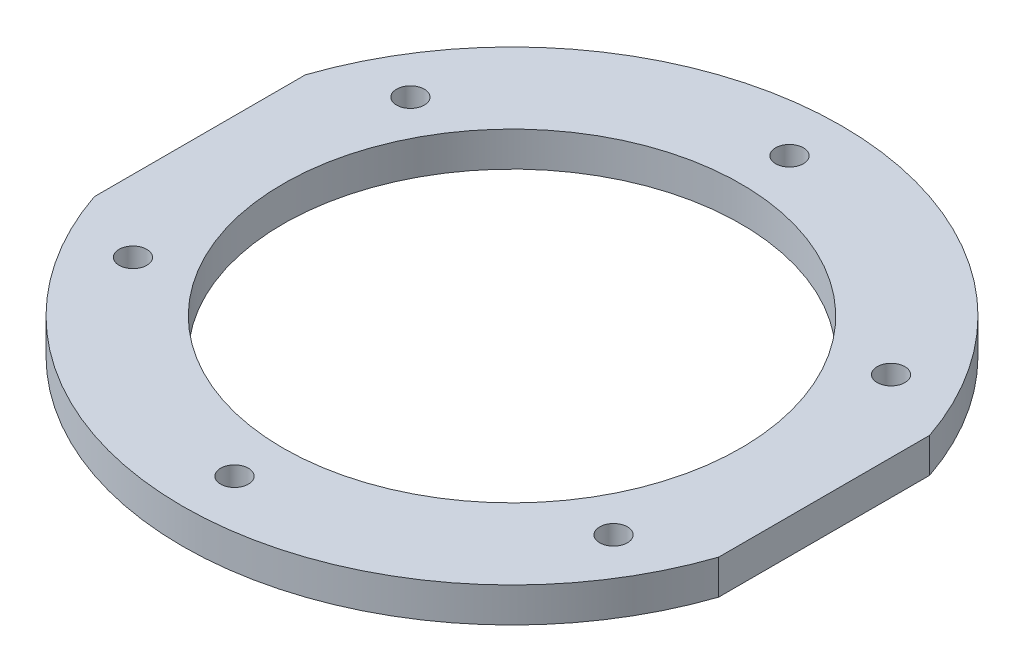
ISO-10303-21;
HEADER;
FILE_DESCRIPTION(('STEP AP214'),'2;1');
FILE_NAME('part.step','',(''),(''),'','','');
FILE_SCHEMA(('AUTOMOTIVE_DESIGN { 1 0 10303 214 1 1 1 1 }'));
ENDSEC;
DATA;
#1=APPLICATION_CONTEXT('core data for automotive mechanical design processes');
#2=APPLICATION_PROTOCOL_DEFINITION('international standard','automotive_design',2000,#1);
#3=PRODUCT_CONTEXT('',#1,'mechanical');
#4=PRODUCT('Part','Part','',(#3));
#5=PRODUCT_RELATED_PRODUCT_CATEGORY('part','',(#4));
#6=PRODUCT_DEFINITION_FORMATION('','',#4);
#7=PRODUCT_DEFINITION_CONTEXT('part definition',#1,'design');
#8=PRODUCT_DEFINITION('design','',#6,#7);
#9=PRODUCT_DEFINITION_SHAPE('','',#8);
#10=(LENGTH_UNIT() NAMED_UNIT(*) SI_UNIT(.MILLI.,.METRE.));
#11=(NAMED_UNIT(*) PLANE_ANGLE_UNIT() SI_UNIT($,.RADIAN.));
#12=(NAMED_UNIT(*) SI_UNIT($,.STERADIAN.) SOLID_ANGLE_UNIT());
#13=UNCERTAINTY_MEASURE_WITH_UNIT(LENGTH_MEASURE(1.E-05),#10,'distance_accuracy_value','');
#14=(GEOMETRIC_REPRESENTATION_CONTEXT(3) GLOBAL_UNCERTAINTY_ASSIGNED_CONTEXT((#13)) GLOBAL_UNIT_ASSIGNED_CONTEXT((#10,
#11,#12)) REPRESENTATION_CONTEXT('',''));
#15=CARTESIAN_POINT('',(0.,0.,0.));
#16=DIRECTION('',(0.,0.,1.));
#17=DIRECTION('',(1.,0.,0.));
#18=AXIS2_PLACEMENT_3D('',#15,#16,#17);
#19=CARTESIAN_POINT('',(0.,5.,0.));
#20=DIRECTION('',(0.,-1.,0.));
#21=DIRECTION('',(0.,0.,-1.));
#22=AXIS2_PLACEMENT_3D('',#19,#20,#21);
#23=CYLINDRICAL_SURFACE('',#22,47.5);
#24=CARTESIAN_POINT('',(0.,5.,0.));
#25=DIRECTION('',(0.,1.,0.));
#26=DIRECTION('',(0.,0.,1.));
#27=AXIS2_PLACEMENT_3D('',#24,#25,#26);
#28=CIRCLE('',#27,47.5);
#29=CARTESIAN_POINT('',(45.,5.,-15.2069063257456));
#30=VERTEX_POINT('',#29);
#31=CARTESIAN_POINT('',(-45.,5.,-15.2069063257456));
#32=VERTEX_POINT('',#31);
#33=EDGE_CURVE('E58',#30,#32,#28,.T.);
#34=ORIENTED_EDGE('',*,*,#33,.F.);
#35=DIRECTION('',(0.,-1.,0.));
#36=VECTOR('',#35,1.);
#37=CARTESIAN_POINT('',(45.,5.,-15.2069063257456));
#38=LINE('',#37,#36);
#39=CARTESIAN_POINT('',(45.,0.,-15.2069063257456));
#40=VERTEX_POINT('',#39);
#41=EDGE_CURVE('E11',#30,#40,#38,.T.);
#42=ORIENTED_EDGE('',*,*,#41,.T.);
#43=CARTESIAN_POINT('',(0.,0.,0.));
#44=DIRECTION('',(0.,1.,0.));
#45=DIRECTION('',(0.,0.,1.));
#46=AXIS2_PLACEMENT_3D('',#43,#44,#45);
#47=CIRCLE('',#46,47.5);
#48=CARTESIAN_POINT('',(-45.,0.,-15.2069063257456));
#49=VERTEX_POINT('',#48);
#50=EDGE_CURVE('E91',#40,#49,#47,.T.);
#51=ORIENTED_EDGE('',*,*,#50,.T.);
#52=DIRECTION('',(0.,-1.,0.));
#53=VECTOR('',#52,1.);
#54=CARTESIAN_POINT('',(-45.,5.,-15.2069063257456));
#55=LINE('',#54,#53);
#56=EDGE_CURVE('E101',#49,#32,#55,.F.);
#57=ORIENTED_EDGE('',*,*,#56,.T.);
#58=EDGE_LOOP('',(#34,#42,#51,#57));
#59=FACE_BOUND('',#58,.T.);
#60=ADVANCED_FACE('F34',(#59),#23,.T.);
#61=CARTESIAN_POINT('',(0.,5.,0.));
#62=DIRECTION('',(0.,1.,0.));
#63=DIRECTION('',(0.,0.,1.));
#64=AXIS2_PLACEMENT_3D('',#61,#62,#63);
#65=PLANE('',#64);
#66=CARTESIAN_POINT('',(34.6410161513777,5.,-19.9999999999997));
#67=DIRECTION('',(0.,1.,0.));
#68=DIRECTION('',(0.,0.,1.));
#69=AXIS2_PLACEMENT_3D('',#66,#67,#68);
#70=CIRCLE('',#69,2.);
#71=CARTESIAN_POINT('',(34.6410161513777,5.,-17.9999999999997));
#72=VERTEX_POINT('',#71);
#73=EDGE_CURVE('E116',#72,#72,#70,.T.);
#74=ORIENTED_EDGE('',*,*,#73,.F.);
#75=EDGE_LOOP('',(#74));
#76=FACE_BOUND('',#75,.T.);
#77=CARTESIAN_POINT('',(-34.6410161513777,5.,19.9999999999997));
#78=DIRECTION('',(0.,1.,0.));
#79=DIRECTION('',(0.,0.,1.));
#80=AXIS2_PLACEMENT_3D('',#77,#78,#79);
#81=CIRCLE('',#80,2.);
#82=CARTESIAN_POINT('',(-34.6410161513777,5.,21.9999999999997));
#83=VERTEX_POINT('',#82);
#84=EDGE_CURVE('E122',#83,#83,#81,.T.);
#85=ORIENTED_EDGE('',*,*,#84,.F.);
#86=EDGE_LOOP('',(#85));
#87=FACE_BOUND('',#86,.T.);
#88=CARTESIAN_POINT('',(-34.6410161513775,5.,-20.0000000000002));
#89=DIRECTION('',(0.,1.,0.));
#90=DIRECTION('',(0.,0.,1.));
#91=AXIS2_PLACEMENT_3D('',#88,#89,#90);
#92=CIRCLE('',#91,2.);
#93=CARTESIAN_POINT('',(-34.6410161513775,5.,-18.0000000000002));
#94=VERTEX_POINT('',#93);
#95=EDGE_CURVE('E119',#94,#94,#92,.T.);
#96=ORIENTED_EDGE('',*,*,#95,.F.);
#97=EDGE_LOOP('',(#96));
#98=FACE_BOUND('',#97,.T.);
#99=CARTESIAN_POINT('',(34.6410161513775,5.,20.0000000000002));
#100=DIRECTION('',(0.,1.,0.));
#101=DIRECTION('',(0.,0.,1.));
#102=AXIS2_PLACEMENT_3D('',#99,#100,#101);
#103=CIRCLE('',#102,2.);
#104=CARTESIAN_POINT('',(34.6410161513775,5.,22.0000000000002));
#105=VERTEX_POINT('',#104);
#106=EDGE_CURVE('E112',#105,#105,#103,.T.);
#107=ORIENTED_EDGE('',*,*,#106,.F.);
#108=EDGE_LOOP('',(#107));
#109=FACE_BOUND('',#108,.T.);
#110=CARTESIAN_POINT('',(0.,5.,40.));
#111=DIRECTION('',(0.,1.,0.));
#112=DIRECTION('',(0.,0.,1.));
#113=AXIS2_PLACEMENT_3D('',#110,#111,#112);
#114=CIRCLE('',#113,2.);
#115=CARTESIAN_POINT('',(0.,5.,42.));
#116=VERTEX_POINT('',#115);
#117=EDGE_CURVE('E108',#116,#116,#114,.T.);
#118=ORIENTED_EDGE('',*,*,#117,.F.);
#119=EDGE_LOOP('',(#118));
#120=FACE_BOUND('',#119,.T.);
#121=CARTESIAN_POINT('',(0.,5.,-40.));
#122=DIRECTION('',(0.,1.,0.));
#123=DIRECTION('',(0.,0.,1.));
#124=AXIS2_PLACEMENT_3D('',#121,#122,#123);
#125=CIRCLE('',#124,2.);
#126=CARTESIAN_POINT('',(0.,5.,-38.));
#127=VERTEX_POINT('',#126);
#128=EDGE_CURVE('E92',#127,#127,#125,.T.);
#129=ORIENTED_EDGE('',*,*,#128,.F.);
#130=EDGE_LOOP('',(#129));
#131=FACE_BOUND('',#130,.T.);
#132=DIRECTION('',(0.,0.,1.));
#133=VECTOR('',#132,1.);
#134=CARTESIAN_POINT('',(45.,5.,0.));
#135=LINE('',#134,#133);
#136=CARTESIAN_POINT('',(45.,5.,15.2069063257456));
#137=VERTEX_POINT('',#136);
#138=EDGE_CURVE('E51',#30,#137,#135,.T.);
#139=ORIENTED_EDGE('',*,*,#138,.F.);
#140=ORIENTED_EDGE('',*,*,#33,.T.);
#141=DIRECTION('',(0.,0.,-1.));
#142=VECTOR('',#141,1.);
#143=CARTESIAN_POINT('',(-45.,5.,0.));
#144=LINE('',#143,#142);
#145=CARTESIAN_POINT('',(-45.,5.,15.2069063257456));
#146=VERTEX_POINT('',#145);
#147=EDGE_CURVE('E143',#146,#32,#144,.T.);
#148=ORIENTED_EDGE('',*,*,#147,.F.);
#149=EDGE_CURVE('E96',#146,#137,#28,.T.);
#150=ORIENTED_EDGE('',*,*,#149,.T.);
#151=EDGE_LOOP('',(#139,#140,#148,#150));
#152=FACE_BOUND('',#151,.T.);
#153=CARTESIAN_POINT('',(0.,5.,0.));
#154=DIRECTION('',(0.,1.,0.));
#155=DIRECTION('',(0.,0.,1.));
#156=AXIS2_PLACEMENT_3D('',#153,#154,#155);
#157=CIRCLE('',#156,33.);
#158=CARTESIAN_POINT('',(0.,5.,33.));
#159=VERTEX_POINT('',#158);
#160=EDGE_CURVE('E98',#159,#159,#157,.T.);
#161=ORIENTED_EDGE('',*,*,#160,.F.);
#162=EDGE_LOOP('',(#161));
#163=FACE_BOUND('',#162,.T.);
#164=ADVANCED_FACE('F163',(#76,#87,#98,#109,#120,#131,#152,#163),#65,.T.);
#165=CARTESIAN_POINT('',(0.,0.,0.));
#166=DIRECTION('',(0.,1.,0.));
#167=DIRECTION('',(0.,0.,1.));
#168=AXIS2_PLACEMENT_3D('',#165,#166,#167);
#169=PLANE('',#168);
#170=CARTESIAN_POINT('',(34.6410161513777,0.,-19.9999999999997));
#171=DIRECTION('',(0.,1.,0.));
#172=DIRECTION('',(0.,0.,1.));
#173=AXIS2_PLACEMENT_3D('',#170,#171,#172);
#174=CIRCLE('',#173,2.);
#175=CARTESIAN_POINT('',(34.6410161513777,0.,-17.9999999999997));
#176=VERTEX_POINT('',#175);
#177=EDGE_CURVE('E38',#176,#176,#174,.T.);
#178=ORIENTED_EDGE('',*,*,#177,.T.);
#179=EDGE_LOOP('',(#178));
#180=FACE_BOUND('',#179,.T.);
#181=CARTESIAN_POINT('',(-34.6410161513777,0.,19.9999999999997));
#182=DIRECTION('',(0.,1.,0.));
#183=DIRECTION('',(0.,0.,1.));
#184=AXIS2_PLACEMENT_3D('',#181,#182,#183);
#185=CIRCLE('',#184,2.);
#186=CARTESIAN_POINT('',(-34.6410161513777,0.,21.9999999999997));
#187=VERTEX_POINT('',#186);
#188=EDGE_CURVE('E120',#187,#187,#185,.T.);
#189=ORIENTED_EDGE('',*,*,#188,.T.);
#190=EDGE_LOOP('',(#189));
#191=FACE_BOUND('',#190,.T.);
#192=CARTESIAN_POINT('',(-34.6410161513775,0.,-20.0000000000002));
#193=DIRECTION('',(0.,1.,0.));
#194=DIRECTION('',(0.,0.,1.));
#195=AXIS2_PLACEMENT_3D('',#192,#193,#194);
#196=CIRCLE('',#195,2.);
#197=CARTESIAN_POINT('',(-34.6410161513775,0.,-18.0000000000002));
#198=VERTEX_POINT('',#197);
#199=EDGE_CURVE('E117',#198,#198,#196,.T.);
#200=ORIENTED_EDGE('',*,*,#199,.T.);
#201=EDGE_LOOP('',(#200));
#202=FACE_BOUND('',#201,.T.);
#203=CARTESIAN_POINT('',(34.6410161513775,0.,20.0000000000002));
#204=DIRECTION('',(0.,1.,0.));
#205=DIRECTION('',(0.,0.,1.));
#206=AXIS2_PLACEMENT_3D('',#203,#204,#205);
#207=CIRCLE('',#206,2.);
#208=CARTESIAN_POINT('',(34.6410161513775,0.,22.0000000000002));
#209=VERTEX_POINT('',#208);
#210=EDGE_CURVE('E113',#209,#209,#207,.T.);
#211=ORIENTED_EDGE('',*,*,#210,.T.);
#212=EDGE_LOOP('',(#211));
#213=FACE_BOUND('',#212,.T.);
#214=CARTESIAN_POINT('',(0.,0.,40.));
#215=DIRECTION('',(0.,1.,0.));
#216=DIRECTION('',(0.,0.,1.));
#217=AXIS2_PLACEMENT_3D('',#214,#215,#216);
#218=CIRCLE('',#217,2.);
#219=CARTESIAN_POINT('',(0.,0.,42.));
#220=VERTEX_POINT('',#219);
#221=EDGE_CURVE('E109',#220,#220,#218,.T.);
#222=ORIENTED_EDGE('',*,*,#221,.T.);
#223=EDGE_LOOP('',(#222));
#224=FACE_BOUND('',#223,.T.);
#225=CARTESIAN_POINT('',(0.,0.,-40.));
#226=DIRECTION('',(0.,1.,0.));
#227=DIRECTION('',(0.,0.,1.));
#228=AXIS2_PLACEMENT_3D('',#225,#226,#227);
#229=CIRCLE('',#228,2.);
#230=CARTESIAN_POINT('',(0.,0.,-38.));
#231=VERTEX_POINT('',#230);
#232=EDGE_CURVE('E105',#231,#231,#229,.T.);
#233=ORIENTED_EDGE('',*,*,#232,.T.);
#234=EDGE_LOOP('',(#233));
#235=FACE_BOUND('',#234,.T.);
#236=ORIENTED_EDGE('',*,*,#50,.F.);
#237=DIRECTION('',(0.,0.,1.));
#238=VECTOR('',#237,1.);
#239=CARTESIAN_POINT('',(45.,0.,0.));
#240=LINE('',#239,#238);
#241=CARTESIAN_POINT('',(45.,0.,15.2069063257456));
#242=VERTEX_POINT('',#241);
#243=EDGE_CURVE('E77',#40,#242,#240,.T.);
#244=ORIENTED_EDGE('',*,*,#243,.T.);
#245=CARTESIAN_POINT('',(-45.,0.,15.2069063257456));
#246=VERTEX_POINT('',#245);
#247=EDGE_CURVE('E90',#246,#242,#47,.T.);
#248=ORIENTED_EDGE('',*,*,#247,.F.);
#249=DIRECTION('',(0.,0.,-1.));
#250=VECTOR('',#249,1.);
#251=CARTESIAN_POINT('',(-45.,0.,0.));
#252=LINE('',#251,#250);
#253=EDGE_CURVE('E141',#246,#49,#252,.T.);
#254=ORIENTED_EDGE('',*,*,#253,.T.);
#255=EDGE_LOOP('',(#236,#244,#248,#254));
#256=FACE_BOUND('',#255,.T.);
#257=CARTESIAN_POINT('',(0.,0.,0.));
#258=DIRECTION('',(0.,1.,0.));
#259=DIRECTION('',(0.,0.,1.));
#260=AXIS2_PLACEMENT_3D('',#257,#258,#259);
#261=CIRCLE('',#260,33.);
#262=CARTESIAN_POINT('',(0.,0.,33.));
#263=VERTEX_POINT('',#262);
#264=EDGE_CURVE('E145',#263,#263,#261,.T.);
#265=ORIENTED_EDGE('',*,*,#264,.T.);
#266=EDGE_LOOP('',(#265));
#267=FACE_BOUND('',#266,.T.);
#268=ADVANCED_FACE('F87',(#180,#191,#202,#213,#224,#235,#256,#267),#169,.F.);
#269=ORIENTED_EDGE('',*,*,#247,.T.);
#270=DIRECTION('',(0.,-1.,0.));
#271=VECTOR('',#270,1.);
#272=CARTESIAN_POINT('',(45.,5.,15.2069063257456));
#273=LINE('',#272,#271);
#274=EDGE_CURVE('E43',#242,#137,#273,.F.);
#275=ORIENTED_EDGE('',*,*,#274,.T.);
#276=ORIENTED_EDGE('',*,*,#149,.F.);
#277=DIRECTION('',(0.,-1.,0.));
#278=VECTOR('',#277,1.);
#279=CARTESIAN_POINT('',(-45.,5.,15.2069063257456));
#280=LINE('',#279,#278);
#281=EDGE_CURVE('E82',#146,#246,#280,.T.);
#282=ORIENTED_EDGE('',*,*,#281,.T.);
#283=EDGE_LOOP('',(#269,#275,#276,#282));
#284=FACE_BOUND('',#283,.T.);
#285=ADVANCED_FACE('F36',(#284),#23,.T.);
#286=CARTESIAN_POINT('',(0.,5.,0.));
#287=DIRECTION('',(0.,-1.,0.));
#288=DIRECTION('',(0.,0.,-1.));
#289=AXIS2_PLACEMENT_3D('',#286,#287,#288);
#290=CYLINDRICAL_SURFACE('',#289,33.);
#291=ORIENTED_EDGE('',*,*,#160,.T.);
#292=EDGE_LOOP('',(#291));
#293=FACE_BOUND('',#292,.T.);
#294=ORIENTED_EDGE('',*,*,#264,.F.);
#295=EDGE_LOOP('',(#294));
#296=FACE_BOUND('',#295,.T.);
#297=ADVANCED_FACE('F150',(#293,#296),#290,.F.);
#298=CARTESIAN_POINT('',(-45.,15.,-25.));
#299=DIRECTION('',(1.,0.,0.));
#300=DIRECTION('',(0.,0.,-1.));
#301=AXIS2_PLACEMENT_3D('',#298,#299,#300);
#302=PLANE('',#301);
#303=ORIENTED_EDGE('',*,*,#147,.T.);
#304=ORIENTED_EDGE('',*,*,#56,.F.);
#305=ORIENTED_EDGE('',*,*,#253,.F.);
#306=ORIENTED_EDGE('',*,*,#281,.F.);
#307=EDGE_LOOP('',(#303,#304,#305,#306));
#308=FACE_BOUND('',#307,.T.);
#309=ADVANCED_FACE('F152',(#308),#302,.F.);
#310=CARTESIAN_POINT('',(45.,15.,-25.));
#311=DIRECTION('',(-1.,0.,0.));
#312=DIRECTION('',(0.,0.,1.));
#313=AXIS2_PLACEMENT_3D('',#310,#311,#312);
#314=PLANE('',#313);
#315=ORIENTED_EDGE('',*,*,#138,.T.);
#316=ORIENTED_EDGE('',*,*,#274,.F.);
#317=ORIENTED_EDGE('',*,*,#243,.F.);
#318=ORIENTED_EDGE('',*,*,#41,.F.);
#319=EDGE_LOOP('',(#315,#316,#317,#318));
#320=FACE_BOUND('',#319,.T.);
#321=ADVANCED_FACE('F76',(#320),#314,.F.);
#322=CARTESIAN_POINT('',(0.,-25.,-40.));
#323=DIRECTION('',(0.,1.,0.));
#324=DIRECTION('',(0.,0.,1.));
#325=AXIS2_PLACEMENT_3D('',#322,#323,#324);
#326=CYLINDRICAL_SURFACE('',#325,2.);
#327=ORIENTED_EDGE('',*,*,#128,.T.);
#328=EDGE_LOOP('',(#327));
#329=FACE_BOUND('',#328,.T.);
#330=ORIENTED_EDGE('',*,*,#232,.F.);
#331=EDGE_LOOP('',(#330));
#332=FACE_BOUND('',#331,.T.);
#333=ADVANCED_FACE('F187',(#329,#332),#326,.F.);
#334=CARTESIAN_POINT('',(0.,-25.,40.));
#335=DIRECTION('',(0.,1.,0.));
#336=DIRECTION('',(0.,0.,1.));
#337=AXIS2_PLACEMENT_3D('',#334,#335,#336);
#338=CYLINDRICAL_SURFACE('',#337,2.);
#339=ORIENTED_EDGE('',*,*,#117,.T.);
#340=EDGE_LOOP('',(#339));
#341=FACE_BOUND('',#340,.T.);
#342=ORIENTED_EDGE('',*,*,#221,.F.);
#343=EDGE_LOOP('',(#342));
#344=FACE_BOUND('',#343,.T.);
#345=ADVANCED_FACE('F190',(#341,#344),#338,.F.);
#346=CARTESIAN_POINT('',(34.6410161513775,-25.,20.0000000000002));
#347=DIRECTION('',(0.,1.,0.));
#348=DIRECTION('',(0.,0.,1.));
#349=AXIS2_PLACEMENT_3D('',#346,#347,#348);
#350=CYLINDRICAL_SURFACE('',#349,2.);
#351=ORIENTED_EDGE('',*,*,#106,.T.);
#352=EDGE_LOOP('',(#351));
#353=FACE_BOUND('',#352,.T.);
#354=ORIENTED_EDGE('',*,*,#210,.F.);
#355=EDGE_LOOP('',(#354));
#356=FACE_BOUND('',#355,.T.);
#357=ADVANCED_FACE('F198',(#353,#356),#350,.F.);
#358=CARTESIAN_POINT('',(-34.6410161513775,-25.,-20.0000000000002));
#359=DIRECTION('',(0.,1.,0.));
#360=DIRECTION('',(0.,0.,1.));
#361=AXIS2_PLACEMENT_3D('',#358,#359,#360);
#362=CYLINDRICAL_SURFACE('',#361,2.);
#363=ORIENTED_EDGE('',*,*,#95,.T.);
#364=EDGE_LOOP('',(#363));
#365=FACE_BOUND('',#364,.T.);
#366=ORIENTED_EDGE('',*,*,#199,.F.);
#367=EDGE_LOOP('',(#366));
#368=FACE_BOUND('',#367,.T.);
#369=ADVANCED_FACE('F205',(#365,#368),#362,.F.);
#370=CARTESIAN_POINT('',(-34.6410161513777,-25.,19.9999999999997));
#371=DIRECTION('',(0.,1.,0.));
#372=DIRECTION('',(0.,0.,1.));
#373=AXIS2_PLACEMENT_3D('',#370,#371,#372);
#374=CYLINDRICAL_SURFACE('',#373,2.);
#375=ORIENTED_EDGE('',*,*,#84,.T.);
#376=EDGE_LOOP('',(#375));
#377=FACE_BOUND('',#376,.T.);
#378=ORIENTED_EDGE('',*,*,#188,.F.);
#379=EDGE_LOOP('',(#378));
#380=FACE_BOUND('',#379,.T.);
#381=ADVANCED_FACE('F209',(#377,#380),#374,.F.);
#382=CARTESIAN_POINT('',(34.6410161513777,-25.,-19.9999999999997));
#383=DIRECTION('',(0.,1.,0.));
#384=DIRECTION('',(0.,0.,1.));
#385=AXIS2_PLACEMENT_3D('',#382,#383,#384);
#386=CYLINDRICAL_SURFACE('',#385,2.);
#387=ORIENTED_EDGE('',*,*,#73,.T.);
#388=EDGE_LOOP('',(#387));
#389=FACE_BOUND('',#388,.T.);
#390=ORIENTED_EDGE('',*,*,#177,.F.);
#391=EDGE_LOOP('',(#390));
#392=FACE_BOUND('',#391,.T.);
#393=ADVANCED_FACE('F210',(#389,#392),#386,.F.);
#394=CLOSED_SHELL('',(#60,#164,#268,#285,#297,#309,#321,#333,#345,#357,#369,#381,#393));
#395=MANIFOLD_SOLID_BREP('B2',#394);
#396=ADVANCED_BREP_SHAPE_REPRESENTATION('',(#18,#395),#14);
#397=SHAPE_DEFINITION_REPRESENTATION(#9,#396);
ENDSEC;
END-ISO-10303-21;
